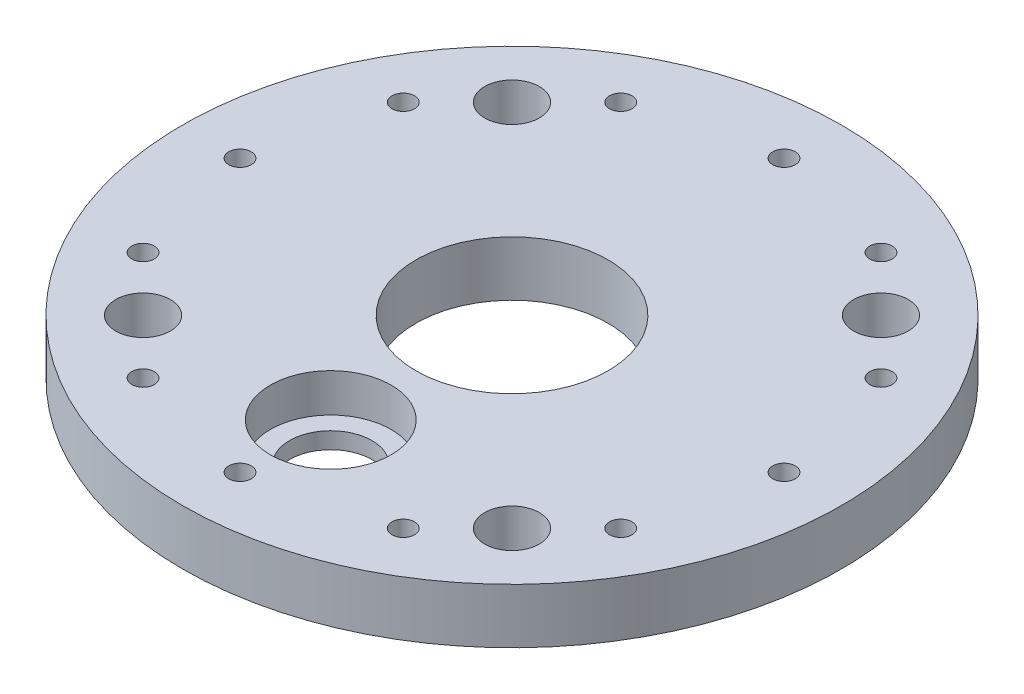
ISO-10303-21;
HEADER;
FILE_DESCRIPTION(('STEP AP214'),'2;1');
FILE_NAME('part.step','',(''),(''),'','','');
FILE_SCHEMA(('AUTOMOTIVE_DESIGN { 1 0 10303 214 1 1 1 1 }'));
ENDSEC;
DATA;
#1=APPLICATION_CONTEXT('core data for automotive mechanical design processes');
#2=APPLICATION_PROTOCOL_DEFINITION('international standard','automotive_design',2000,#1);
#3=PRODUCT_CONTEXT('',#1,'mechanical');
#4=PRODUCT('Part','Part','',(#3));
#5=PRODUCT_RELATED_PRODUCT_CATEGORY('part','',(#4));
#6=PRODUCT_DEFINITION_FORMATION('','',#4);
#7=PRODUCT_DEFINITION_CONTEXT('part definition',#1,'design');
#8=PRODUCT_DEFINITION('design','',#6,#7);
#9=PRODUCT_DEFINITION_SHAPE('','',#8);
#10=(LENGTH_UNIT() NAMED_UNIT(*) SI_UNIT(.MILLI.,.METRE.));
#11=(NAMED_UNIT(*) PLANE_ANGLE_UNIT() SI_UNIT($,.RADIAN.));
#12=(NAMED_UNIT(*) SI_UNIT($,.STERADIAN.) SOLID_ANGLE_UNIT());
#13=UNCERTAINTY_MEASURE_WITH_UNIT(LENGTH_MEASURE(1.E-05),#10,'distance_accuracy_value','');
#14=(GEOMETRIC_REPRESENTATION_CONTEXT(3) GLOBAL_UNCERTAINTY_ASSIGNED_CONTEXT((#13)) GLOBAL_UNIT_ASSIGNED_CONTEXT((#10,
#11,#12)) REPRESENTATION_CONTEXT('',''));
#15=CARTESIAN_POINT('',(0.,0.,0.));
#16=DIRECTION('',(0.,0.,1.));
#17=DIRECTION('',(1.,0.,0.));
#18=AXIS2_PLACEMENT_3D('',#15,#16,#17);
#19=CARTESIAN_POINT('',(0.,10.,0.));
#20=DIRECTION('',(0.,-1.,0.));
#21=DIRECTION('',(0.,0.,-1.));
#22=AXIS2_PLACEMENT_3D('',#19,#20,#21);
#23=CYLINDRICAL_SURFACE('',#22,60.);
#24=CARTESIAN_POINT('',(0.,10.,0.));
#25=DIRECTION('',(0.,1.,0.));
#26=DIRECTION('',(0.,0.,1.));
#27=AXIS2_PLACEMENT_3D('',#24,#25,#26);
#28=CIRCLE('',#27,60.);
#29=CARTESIAN_POINT('',(0.,10.,60.));
#30=VERTEX_POINT('',#29);
#31=EDGE_CURVE('E10',#30,#30,#28,.T.);
#32=ORIENTED_EDGE('',*,*,#31,.F.);
#33=EDGE_LOOP('',(#32));
#34=FACE_BOUND('',#33,.T.);
#35=CARTESIAN_POINT('',(0.,0.,0.));
#36=DIRECTION('',(0.,1.,0.));
#37=DIRECTION('',(0.,0.,1.));
#38=AXIS2_PLACEMENT_3D('',#35,#36,#37);
#39=CIRCLE('',#38,60.);
#40=CARTESIAN_POINT('',(0.,0.,60.));
#41=VERTEX_POINT('',#40);
#42=EDGE_CURVE('E41',#41,#41,#39,.T.);
#43=ORIENTED_EDGE('',*,*,#42,.T.);
#44=EDGE_LOOP('',(#43));
#45=FACE_BOUND('',#44,.T.);
#46=ADVANCED_FACE('F36',(#34,#45),#23,.T.);
#47=CARTESIAN_POINT('',(0.,10.,0.));
#48=DIRECTION('',(0.,1.,0.));
#49=DIRECTION('',(0.,0.,1.));
#50=AXIS2_PLACEMENT_3D('',#47,#48,#49);
#51=PLANE('',#50);
#52=CARTESIAN_POINT('',(0.,10.,0.));
#53=DIRECTION('',(0.,1.,0.));
#54=DIRECTION('',(0.,0.,1.));
#55=AXIS2_PLACEMENT_3D('',#52,#53,#54);
#56=CIRCLE('',#55,17.5);
#57=CARTESIAN_POINT('',(0.,10.,17.5));
#58=VERTEX_POINT('',#57);
#59=EDGE_CURVE('E158',#58,#58,#56,.T.);
#60=ORIENTED_EDGE('',*,*,#59,.F.);
#61=EDGE_LOOP('',(#60));
#62=FACE_BOUND('',#61,.T.);
#63=CARTESIAN_POINT('',(-49.52,10.,-1.72898155899512E-13));
#64=DIRECTION('',(0.,1.,0.));
#65=DIRECTION('',(-1.,0.,0.));
#66=AXIS2_PLACEMENT_3D('',#63,#64,#65);
#67=CIRCLE('',#66,2.05);
#68=CARTESIAN_POINT('',(-51.57,10.,-1.8005569264414E-13));
#69=VERTEX_POINT('',#68);
#70=EDGE_CURVE('E153',#69,#69,#67,.T.);
#71=ORIENTED_EDGE('',*,*,#70,.F.);
#72=EDGE_LOOP('',(#71));
#73=FACE_BOUND('',#72,.T.);
#74=CARTESIAN_POINT('',(0.,10.,-49.52));
#75=DIRECTION('',(0.,1.,0.));
#76=DIRECTION('',(0.,0.,-1.));
#77=AXIS2_PLACEMENT_3D('',#74,#75,#76);
#78=CIRCLE('',#77,2.05);
#79=CARTESIAN_POINT('',(0.,10.,-51.57));
#80=VERTEX_POINT('',#79);
#81=EDGE_CURVE('E150',#80,#80,#78,.T.);
#82=ORIENTED_EDGE('',*,*,#81,.F.);
#83=EDGE_LOOP('',(#82));
#84=FACE_BOUND('',#83,.T.);
#85=CARTESIAN_POINT('',(49.52,10.,5.18694467698536E-13));
#86=DIRECTION('',(0.,1.,0.));
#87=DIRECTION('',(1.,0.,0.));
#88=AXIS2_PLACEMENT_3D('',#85,#86,#87);
#89=CIRCLE('',#88,2.05);
#90=CARTESIAN_POINT('',(51.57,10.,5.40167077932421E-13));
#91=VERTEX_POINT('',#90);
#92=EDGE_CURVE('E140',#91,#91,#89,.T.);
#93=ORIENTED_EDGE('',*,*,#92,.F.);
#94=EDGE_LOOP('',(#93));
#95=FACE_BOUND('',#94,.T.);
#96=CARTESIAN_POINT('',(-23.6880771697492,10.,-43.4870670429728));
#97=DIRECTION('',(0.,1.,0.));
#98=DIRECTION('',(-1.,0.,0.));
#99=AXIS2_PLACEMENT_3D('',#96,#97,#98);
#100=CIRCLE('',#99,2.05);
#101=CARTESIAN_POINT('',(-25.7380771697492,10.,-43.4870670429728));
#102=VERTEX_POINT('',#101);
#103=EDGE_CURVE('E112',#102,#102,#100,.T.);
#104=ORIENTED_EDGE('',*,*,#103,.F.);
#105=EDGE_LOOP('',(#104));
#106=FACE_BOUND('',#105,.T.);
#107=CARTESIAN_POINT('',(-43.4870670429726,10.,-23.6880771697495));
#108=DIRECTION('',(0.,1.,0.));
#109=DIRECTION('',(-1.,0.,0.));
#110=AXIS2_PLACEMENT_3D('',#107,#108,#109);
#111=CIRCLE('',#110,2.05);
#112=CARTESIAN_POINT('',(-45.5370670429726,10.,-23.6880771697495));
#113=VERTEX_POINT('',#112);
#114=EDGE_CURVE('E104',#113,#113,#111,.T.);
#115=ORIENTED_EDGE('',*,*,#114,.F.);
#116=EDGE_LOOP('',(#115));
#117=FACE_BOUND('',#116,.T.);
#118=CARTESIAN_POINT('',(33.5875721063611,10.,-33.587572106361));
#119=DIRECTION('',(0.,1.,0.));
#120=DIRECTION('',(0.,0.,-1.));
#121=AXIS2_PLACEMENT_3D('',#118,#119,#120);
#122=CIRCLE('',#121,4.975);
#123=CARTESIAN_POINT('',(33.5875721063611,10.,-38.562572106361));
#124=VERTEX_POINT('',#123);
#125=EDGE_CURVE('E97',#124,#124,#122,.T.);
#126=ORIENTED_EDGE('',*,*,#125,.F.);
#127=EDGE_LOOP('',(#126));
#128=FACE_BOUND('',#127,.T.);
#129=CARTESIAN_POINT('',(43.4870670429727,10.,-23.6880771697493));
#130=DIRECTION('',(0.,1.,0.));
#131=DIRECTION('',(0.,0.,-1.));
#132=AXIS2_PLACEMENT_3D('',#129,#130,#131);
#133=CIRCLE('',#132,2.05);
#134=CARTESIAN_POINT('',(43.4870670429727,10.,-25.7380771697493));
#135=VERTEX_POINT('',#134);
#136=EDGE_CURVE('E95',#135,#135,#133,.T.);
#137=ORIENTED_EDGE('',*,*,#136,.F.);
#138=EDGE_LOOP('',(#137));
#139=FACE_BOUND('',#138,.T.);
#140=CARTESIAN_POINT('',(43.4870670429724,10.,23.6880771697498));
#141=DIRECTION('',(0.,1.,0.));
#142=DIRECTION('',(1.,0.,0.));
#143=AXIS2_PLACEMENT_3D('',#140,#141,#142);
#144=CIRCLE('',#143,2.05);
#145=CARTESIAN_POINT('',(45.5370670429724,10.,23.6880771697498));
#146=VERTEX_POINT('',#145);
#147=EDGE_CURVE('E126',#146,#146,#144,.T.);
#148=ORIENTED_EDGE('',*,*,#147,.F.);
#149=EDGE_LOOP('',(#148));
#150=FACE_BOUND('',#149,.T.);
#151=CARTESIAN_POINT('',(23.6880771697489,10.,43.4870670429729));
#152=DIRECTION('',(0.,1.,0.));
#153=DIRECTION('',(1.,0.,0.));
#154=AXIS2_PLACEMENT_3D('',#151,#152,#153);
#155=CIRCLE('',#154,2.05);
#156=CARTESIAN_POINT('',(25.7380771697489,10.,43.4870670429729));
#157=VERTEX_POINT('',#156);
#158=EDGE_CURVE('E134',#157,#157,#155,.T.);
#159=ORIENTED_EDGE('',*,*,#158,.F.);
#160=EDGE_LOOP('',(#159));
#161=FACE_BOUND('',#160,.T.);
#162=CARTESIAN_POINT('',(33.5875721063606,10.,33.5875721063614));
#163=DIRECTION('',(0.,1.,0.));
#164=DIRECTION('',(1.,0.,0.));
#165=AXIS2_PLACEMENT_3D('',#162,#163,#164);
#166=CIRCLE('',#165,4.975);
#167=CARTESIAN_POINT('',(38.5625721063606,10.,33.5875721063615));
#168=VERTEX_POINT('',#167);
#169=EDGE_CURVE('E116',#168,#168,#166,.T.);
#170=ORIENTED_EDGE('',*,*,#169,.F.);
#171=EDGE_LOOP('',(#170));
#172=FACE_BOUND('',#171,.T.);
#173=CARTESIAN_POINT('',(23.6880771697493,10.,-43.4870670429727));
#174=DIRECTION('',(0.,1.,0.));
#175=DIRECTION('',(0.,0.,-1.));
#176=AXIS2_PLACEMENT_3D('',#173,#174,#175);
#177=CIRCLE('',#176,2.05);
#178=CARTESIAN_POINT('',(23.6880771697493,10.,-45.5370670429727));
#179=VERTEX_POINT('',#178);
#180=EDGE_CURVE('E121',#179,#179,#177,.T.);
#181=ORIENTED_EDGE('',*,*,#180,.F.);
#182=EDGE_LOOP('',(#181));
#183=FACE_BOUND('',#182,.T.);
#184=CARTESIAN_POINT('',(-33.5875721063608,10.,-33.5875721063612));
#185=DIRECTION('',(0.,1.,0.));
#186=DIRECTION('',(-1.,0.,0.));
#187=AXIS2_PLACEMENT_3D('',#184,#185,#186);
#188=CIRCLE('',#187,4.975);
#189=CARTESIAN_POINT('',(-38.5625721063608,10.,-33.5875721063612));
#190=VERTEX_POINT('',#189);
#191=EDGE_CURVE('E88',#190,#190,#188,.T.);
#192=ORIENTED_EDGE('',*,*,#191,.F.);
#193=EDGE_LOOP('',(#192));
#194=FACE_BOUND('',#193,.T.);
#195=CARTESIAN_POINT('',(0.,10.,49.52));
#196=DIRECTION('',(0.,1.,0.));
#197=DIRECTION('',(0.,0.,1.));
#198=AXIS2_PLACEMENT_3D('',#195,#196,#197);
#199=CIRCLE('',#198,2.05);
#200=CARTESIAN_POINT('',(0.,10.,51.57));
#201=VERTEX_POINT('',#200);
#202=EDGE_CURVE('E79',#201,#201,#199,.T.);
#203=ORIENTED_EDGE('',*,*,#202,.F.);
#204=EDGE_LOOP('',(#203));
#205=FACE_BOUND('',#204,.T.);
#206=CARTESIAN_POINT('',(-23.6880771697493,10.,43.4870670429727));
#207=DIRECTION('',(0.,1.,0.));
#208=DIRECTION('',(0.,0.,1.));
#209=AXIS2_PLACEMENT_3D('',#206,#207,#208);
#210=CIRCLE('',#209,2.05);
#211=CARTESIAN_POINT('',(-23.6880771697493,10.,45.5370670429727));
#212=VERTEX_POINT('',#211);
#213=EDGE_CURVE('E66',#212,#212,#210,.T.);
#214=ORIENTED_EDGE('',*,*,#213,.F.);
#215=EDGE_LOOP('',(#214));
#216=FACE_BOUND('',#215,.T.);
#217=CARTESIAN_POINT('',(-43.4870670429727,10.,23.6880771697493));
#218=DIRECTION('',(0.,1.,0.));
#219=DIRECTION('',(0.,0.,1.));
#220=AXIS2_PLACEMENT_3D('',#217,#218,#219);
#221=CIRCLE('',#220,2.05);
#222=CARTESIAN_POINT('',(-43.4870670429727,10.,25.7380771697493));
#223=VERTEX_POINT('',#222);
#224=EDGE_CURVE('E73',#223,#223,#221,.T.);
#225=ORIENTED_EDGE('',*,*,#224,.F.);
#226=EDGE_LOOP('',(#225));
#227=FACE_BOUND('',#226,.T.);
#228=CARTESIAN_POINT('',(-33.5875721063611,10.,33.587572106361));
#229=DIRECTION('',(0.,1.,0.));
#230=DIRECTION('',(0.,0.,1.));
#231=AXIS2_PLACEMENT_3D('',#228,#229,#230);
#232=CIRCLE('',#231,4.975);
#233=CARTESIAN_POINT('',(-33.5875721063611,10.,38.562572106361));
#234=VERTEX_POINT('',#233);
#235=EDGE_CURVE('E65',#234,#234,#232,.T.);
#236=ORIENTED_EDGE('',*,*,#235,.F.);
#237=EDGE_LOOP('',(#236));
#238=FACE_BOUND('',#237,.T.);
#239=CARTESIAN_POINT('',(0.,10.,33.));
#240=DIRECTION('',(0.,1.,0.));
#241=DIRECTION('',(0.,0.,1.));
#242=AXIS2_PLACEMENT_3D('',#239,#240,#241);
#243=CIRCLE('',#242,11.);
#244=CARTESIAN_POINT('',(0.,10.,44.));
#245=VERTEX_POINT('',#244);
#246=EDGE_CURVE('E49',#245,#245,#243,.T.);
#247=ORIENTED_EDGE('',*,*,#246,.F.);
#248=EDGE_LOOP('',(#247));
#249=FACE_BOUND('',#248,.T.);
#250=ORIENTED_EDGE('',*,*,#31,.T.);
#251=EDGE_LOOP('',(#250));
#252=FACE_BOUND('',#251,.T.);
#253=ADVANCED_FACE('F173',(#62,#73,#84,#95,#106,#117,#128,#139,#150,#161,#172,#183,#194,#205,
#216,#227,#238,#249,#252),#51,.T.);
#254=CARTESIAN_POINT('',(0.,0.,0.));
#255=DIRECTION('',(0.,1.,0.));
#256=DIRECTION('',(0.,0.,1.));
#257=AXIS2_PLACEMENT_3D('',#254,#255,#256);
#258=PLANE('',#257);
#259=CARTESIAN_POINT('',(0.,0.,0.));
#260=DIRECTION('',(0.,1.,0.));
#261=DIRECTION('',(0.,0.,1.));
#262=AXIS2_PLACEMENT_3D('',#259,#260,#261);
#263=CIRCLE('',#262,17.5);
#264=CARTESIAN_POINT('',(0.,0.,17.5));
#265=VERTEX_POINT('',#264);
#266=EDGE_CURVE('E145',#265,#265,#263,.T.);
#267=ORIENTED_EDGE('',*,*,#266,.T.);
#268=EDGE_LOOP('',(#267));
#269=FACE_BOUND('',#268,.T.);
#270=CARTESIAN_POINT('',(-49.52,0.,-1.72898155899512E-13));
#271=DIRECTION('',(0.,1.,0.));
#272=DIRECTION('',(-1.,0.,0.));
#273=AXIS2_PLACEMENT_3D('',#270,#271,#272);
#274=CIRCLE('',#273,2.05);
#275=CARTESIAN_POINT('',(-51.57,0.,-1.8005569264414E-13));
#276=VERTEX_POINT('',#275);
#277=EDGE_CURVE('E135',#276,#276,#274,.T.);
#278=ORIENTED_EDGE('',*,*,#277,.T.);
#279=EDGE_LOOP('',(#278));
#280=FACE_BOUND('',#279,.T.);
#281=CARTESIAN_POINT('',(0.,0.,-49.52));
#282=DIRECTION('',(0.,1.,0.));
#283=DIRECTION('',(0.,0.,-1.));
#284=AXIS2_PLACEMENT_3D('',#281,#282,#283);
#285=CIRCLE('',#284,2.05);
#286=CARTESIAN_POINT('',(0.,0.,-51.57));
#287=VERTEX_POINT('',#286);
#288=EDGE_CURVE('E147',#287,#287,#285,.T.);
#289=ORIENTED_EDGE('',*,*,#288,.T.);
#290=EDGE_LOOP('',(#289));
#291=FACE_BOUND('',#290,.T.);
#292=CARTESIAN_POINT('',(49.52,0.,5.18694467698536E-13));
#293=DIRECTION('',(0.,1.,0.));
#294=DIRECTION('',(1.,0.,0.));
#295=AXIS2_PLACEMENT_3D('',#292,#293,#294);
#296=CIRCLE('',#295,2.05);
#297=CARTESIAN_POINT('',(51.57,0.,5.40167077932421E-13));
#298=VERTEX_POINT('',#297);
#299=EDGE_CURVE('E141',#298,#298,#296,.T.);
#300=ORIENTED_EDGE('',*,*,#299,.T.);
#301=EDGE_LOOP('',(#300));
#302=FACE_BOUND('',#301,.T.);
#303=CARTESIAN_POINT('',(-23.6880771697492,0.,-43.4870670429728));
#304=DIRECTION('',(0.,1.,0.));
#305=DIRECTION('',(-1.,0.,0.));
#306=AXIS2_PLACEMENT_3D('',#303,#304,#305);
#307=CIRCLE('',#306,2.05);
#308=CARTESIAN_POINT('',(-25.7380771697492,0.,-43.4870670429728));
#309=VERTEX_POINT('',#308);
#310=EDGE_CURVE('E90',#309,#309,#307,.T.);
#311=ORIENTED_EDGE('',*,*,#310,.T.);
#312=EDGE_LOOP('',(#311));
#313=FACE_BOUND('',#312,.T.);
#314=CARTESIAN_POINT('',(-43.4870670429726,0.,-23.6880771697495));
#315=DIRECTION('',(0.,1.,0.));
#316=DIRECTION('',(-1.,0.,0.));
#317=AXIS2_PLACEMENT_3D('',#314,#315,#316);
#318=CIRCLE('',#317,2.05);
#319=CARTESIAN_POINT('',(-45.5370670429726,0.,-23.6880771697495));
#320=VERTEX_POINT('',#319);
#321=EDGE_CURVE('E107',#320,#320,#318,.T.);
#322=ORIENTED_EDGE('',*,*,#321,.T.);
#323=EDGE_LOOP('',(#322));
#324=FACE_BOUND('',#323,.T.);
#325=CARTESIAN_POINT('',(33.5875721063611,0.,-33.587572106361));
#326=DIRECTION('',(0.,1.,0.));
#327=DIRECTION('',(0.,0.,-1.));
#328=AXIS2_PLACEMENT_3D('',#325,#326,#327);
#329=CIRCLE('',#328,4.975);
#330=CARTESIAN_POINT('',(33.5875721063611,0.,-38.562572106361));
#331=VERTEX_POINT('',#330);
#332=EDGE_CURVE('E105',#331,#331,#329,.T.);
#333=ORIENTED_EDGE('',*,*,#332,.T.);
#334=EDGE_LOOP('',(#333));
#335=FACE_BOUND('',#334,.T.);
#336=CARTESIAN_POINT('',(43.4870670429727,0.,-23.6880771697493));
#337=DIRECTION('',(0.,1.,0.));
#338=DIRECTION('',(0.,0.,-1.));
#339=AXIS2_PLACEMENT_3D('',#336,#337,#338);
#340=CIRCLE('',#339,2.05);
#341=CARTESIAN_POINT('',(43.4870670429727,0.,-25.7380771697493));
#342=VERTEX_POINT('',#341);
#343=EDGE_CURVE('E92',#342,#342,#340,.T.);
#344=ORIENTED_EDGE('',*,*,#343,.T.);
#345=EDGE_LOOP('',(#344));
#346=FACE_BOUND('',#345,.T.);
#347=CARTESIAN_POINT('',(43.4870670429724,0.,23.6880771697498));
#348=DIRECTION('',(0.,1.,0.));
#349=DIRECTION('',(1.,0.,0.));
#350=AXIS2_PLACEMENT_3D('',#347,#348,#349);
#351=CIRCLE('',#350,2.05);
#352=CARTESIAN_POINT('',(45.5370670429724,0.,23.6880771697498));
#353=VERTEX_POINT('',#352);
#354=EDGE_CURVE('E131',#353,#353,#351,.T.);
#355=ORIENTED_EDGE('',*,*,#354,.T.);
#356=EDGE_LOOP('',(#355));
#357=FACE_BOUND('',#356,.T.);
#358=CARTESIAN_POINT('',(23.6880771697489,0.,43.4870670429729));
#359=DIRECTION('',(0.,1.,0.));
#360=DIRECTION('',(1.,0.,0.));
#361=AXIS2_PLACEMENT_3D('',#358,#359,#360);
#362=CIRCLE('',#361,2.05);
#363=CARTESIAN_POINT('',(25.7380771697489,0.,43.4870670429729));
#364=VERTEX_POINT('',#363);
#365=EDGE_CURVE('E119',#364,#364,#362,.T.);
#366=ORIENTED_EDGE('',*,*,#365,.T.);
#367=EDGE_LOOP('',(#366));
#368=FACE_BOUND('',#367,.T.);
#369=CARTESIAN_POINT('',(33.5875721063606,0.,33.5875721063614));
#370=DIRECTION('',(0.,1.,0.));
#371=DIRECTION('',(1.,0.,0.));
#372=AXIS2_PLACEMENT_3D('',#369,#370,#371);
#373=CIRCLE('',#372,4.975);
#374=CARTESIAN_POINT('',(38.5625721063606,0.,33.5875721063615));
#375=VERTEX_POINT('',#374);
#376=EDGE_CURVE('E118',#375,#375,#373,.T.);
#377=ORIENTED_EDGE('',*,*,#376,.T.);
#378=EDGE_LOOP('',(#377));
#379=FACE_BOUND('',#378,.T.);
#380=CARTESIAN_POINT('',(23.6880771697493,0.,-43.4870670429727));
#381=DIRECTION('',(0.,1.,0.));
#382=DIRECTION('',(0.,0.,-1.));
#383=AXIS2_PLACEMENT_3D('',#380,#381,#382);
#384=CIRCLE('',#383,2.05);
#385=CARTESIAN_POINT('',(23.6880771697493,0.,-45.5370670429727));
#386=VERTEX_POINT('',#385);
#387=EDGE_CURVE('E96',#386,#386,#384,.T.);
#388=ORIENTED_EDGE('',*,*,#387,.T.);
#389=EDGE_LOOP('',(#388));
#390=FACE_BOUND('',#389,.T.);
#391=CARTESIAN_POINT('',(-33.5875721063608,0.,-33.5875721063612));
#392=DIRECTION('',(0.,1.,0.));
#393=DIRECTION('',(-1.,0.,0.));
#394=AXIS2_PLACEMENT_3D('',#391,#392,#393);
#395=CIRCLE('',#394,4.975);
#396=CARTESIAN_POINT('',(-38.5625721063608,0.,-33.5875721063612));
#397=VERTEX_POINT('',#396);
#398=EDGE_CURVE('E84',#397,#397,#395,.T.);
#399=ORIENTED_EDGE('',*,*,#398,.T.);
#400=EDGE_LOOP('',(#399));
#401=FACE_BOUND('',#400,.T.);
#402=CARTESIAN_POINT('',(0.,0.,49.52));
#403=DIRECTION('',(0.,1.,0.));
#404=DIRECTION('',(0.,0.,1.));
#405=AXIS2_PLACEMENT_3D('',#402,#403,#404);
#406=CIRCLE('',#405,2.05);
#407=CARTESIAN_POINT('',(0.,0.,51.57));
#408=VERTEX_POINT('',#407);
#409=EDGE_CURVE('E75',#408,#408,#406,.T.);
#410=ORIENTED_EDGE('',*,*,#409,.T.);
#411=EDGE_LOOP('',(#410));
#412=FACE_BOUND('',#411,.T.);
#413=CARTESIAN_POINT('',(-23.6880771697493,0.,43.4870670429727));
#414=DIRECTION('',(0.,1.,0.));
#415=DIRECTION('',(0.,0.,1.));
#416=AXIS2_PLACEMENT_3D('',#413,#414,#415);
#417=CIRCLE('',#416,2.05);
#418=CARTESIAN_POINT('',(-23.6880771697493,0.,45.5370670429727));
#419=VERTEX_POINT('',#418);
#420=EDGE_CURVE('E72',#419,#419,#417,.T.);
#421=ORIENTED_EDGE('',*,*,#420,.T.);
#422=EDGE_LOOP('',(#421));
#423=FACE_BOUND('',#422,.T.);
#424=CARTESIAN_POINT('',(-43.4870670429727,0.,23.6880771697493));
#425=DIRECTION('',(0.,1.,0.));
#426=DIRECTION('',(0.,0.,1.));
#427=AXIS2_PLACEMENT_3D('',#424,#425,#426);
#428=CIRCLE('',#427,2.05);
#429=CARTESIAN_POINT('',(-43.4870670429727,0.,25.7380771697493));
#430=VERTEX_POINT('',#429);
#431=EDGE_CURVE('E64',#430,#430,#428,.T.);
#432=ORIENTED_EDGE('',*,*,#431,.T.);
#433=EDGE_LOOP('',(#432));
#434=FACE_BOUND('',#433,.T.);
#435=CARTESIAN_POINT('',(-33.5875721063611,0.,33.587572106361));
#436=DIRECTION('',(0.,1.,0.));
#437=DIRECTION('',(0.,0.,1.));
#438=AXIS2_PLACEMENT_3D('',#435,#436,#437);
#439=CIRCLE('',#438,4.975);
#440=CARTESIAN_POINT('',(-33.5875721063611,0.,38.562572106361));
#441=VERTEX_POINT('',#440);
#442=EDGE_CURVE('E56',#441,#441,#439,.T.);
#443=ORIENTED_EDGE('',*,*,#442,.T.);
#444=EDGE_LOOP('',(#443));
#445=FACE_BOUND('',#444,.T.);
#446=CARTESIAN_POINT('',(0.,0.,33.));
#447=DIRECTION('',(0.,1.,0.));
#448=DIRECTION('',(0.,0.,1.));
#449=AXIS2_PLACEMENT_3D('',#446,#447,#448);
#450=CIRCLE('',#449,7.5);
#451=CARTESIAN_POINT('',(0.,0.,40.5));
#452=VERTEX_POINT('',#451);
#453=EDGE_CURVE('E52',#452,#452,#450,.T.);
#454=ORIENTED_EDGE('',*,*,#453,.T.);
#455=EDGE_LOOP('',(#454));
#456=FACE_BOUND('',#455,.T.);
#457=ORIENTED_EDGE('',*,*,#42,.F.);
#458=EDGE_LOOP('',(#457));
#459=FACE_BOUND('',#458,.T.);
#460=ADVANCED_FACE('F163',(#269,#280,#291,#302,#313,#324,#335,#346,#357,#368,#379,#390,#401,
#412,#423,#434,#445,#456,#459),#258,.F.);
#461=CARTESIAN_POINT('',(0.,3.,33.));
#462=DIRECTION('',(0.,1.,0.));
#463=DIRECTION('',(0.,0.,1.));
#464=AXIS2_PLACEMENT_3D('',#461,#462,#463);
#465=CYLINDRICAL_SURFACE('',#464,11.);
#466=CARTESIAN_POINT('',(0.,3.,33.));
#467=DIRECTION('',(0.,1.,0.));
#468=DIRECTION('',(0.,0.,1.));
#469=AXIS2_PLACEMENT_3D('',#466,#467,#468);
#470=CIRCLE('',#469,11.);
#471=CARTESIAN_POINT('',(0.,3.,44.));
#472=VERTEX_POINT('',#471);
#473=EDGE_CURVE('E48',#472,#472,#470,.T.);
#474=ORIENTED_EDGE('',*,*,#473,.F.);
#475=EDGE_LOOP('',(#474));
#476=FACE_BOUND('',#475,.T.);
#477=ORIENTED_EDGE('',*,*,#246,.T.);
#478=EDGE_LOOP('',(#477));
#479=FACE_BOUND('',#478,.T.);
#480=ADVANCED_FACE('F215',(#476,#479),#465,.F.);
#481=CARTESIAN_POINT('',(0.,3.,33.));
#482=DIRECTION('',(0.,1.,0.));
#483=DIRECTION('',(0.,0.,1.));
#484=AXIS2_PLACEMENT_3D('',#481,#482,#483);
#485=PLANE('',#484);
#486=CARTESIAN_POINT('',(0.,3.,33.));
#487=DIRECTION('',(0.,1.,0.));
#488=DIRECTION('',(0.,0.,1.));
#489=AXIS2_PLACEMENT_3D('',#486,#487,#488);
#490=CIRCLE('',#489,7.5);
#491=CARTESIAN_POINT('',(0.,3.,40.5));
#492=VERTEX_POINT('',#491);
#493=EDGE_CURVE('E57',#492,#492,#490,.T.);
#494=ORIENTED_EDGE('',*,*,#493,.F.);
#495=EDGE_LOOP('',(#494));
#496=FACE_BOUND('',#495,.T.);
#497=ORIENTED_EDGE('',*,*,#473,.T.);
#498=EDGE_LOOP('',(#497));
#499=FACE_BOUND('',#498,.T.);
#500=ADVANCED_FACE('F212',(#496,#499),#485,.T.);
#501=CARTESIAN_POINT('',(0.,0.,33.));
#502=DIRECTION('',(0.,1.,0.));
#503=DIRECTION('',(0.,0.,1.));
#504=AXIS2_PLACEMENT_3D('',#501,#502,#503);
#505=CYLINDRICAL_SURFACE('',#504,7.5);
#506=ORIENTED_EDGE('',*,*,#453,.F.);
#507=EDGE_LOOP('',(#506));
#508=FACE_BOUND('',#507,.T.);
#509=ORIENTED_EDGE('',*,*,#493,.T.);
#510=EDGE_LOOP('',(#509));
#511=FACE_BOUND('',#510,.T.);
#512=ADVANCED_FACE('F222',(#508,#511),#505,.F.);
#513=CARTESIAN_POINT('',(-33.5875721063611,0.,33.587572106361));
#514=DIRECTION('',(0.,1.,0.));
#515=DIRECTION('',(0.,0.,1.));
#516=AXIS2_PLACEMENT_3D('',#513,#514,#515);
#517=CYLINDRICAL_SURFACE('',#516,4.975);
#518=ORIENTED_EDGE('',*,*,#442,.F.);
#519=EDGE_LOOP('',(#518));
#520=FACE_BOUND('',#519,.T.);
#521=ORIENTED_EDGE('',*,*,#235,.T.);
#522=EDGE_LOOP('',(#521));
#523=FACE_BOUND('',#522,.T.);
#524=ADVANCED_FACE('F255',(#520,#523),#517,.F.);
#525=CARTESIAN_POINT('',(-43.4870670429727,0.,23.6880771697493));
#526=DIRECTION('',(0.,1.,0.));
#527=DIRECTION('',(0.,0.,1.));
#528=AXIS2_PLACEMENT_3D('',#525,#526,#527);
#529=CYLINDRICAL_SURFACE('',#528,2.05);
#530=ORIENTED_EDGE('',*,*,#431,.F.);
#531=EDGE_LOOP('',(#530));
#532=FACE_BOUND('',#531,.T.);
#533=ORIENTED_EDGE('',*,*,#224,.T.);
#534=EDGE_LOOP('',(#533));
#535=FACE_BOUND('',#534,.T.);
#536=ADVANCED_FACE('F265',(#532,#535),#529,.F.);
#537=CARTESIAN_POINT('',(-23.6880771697493,0.,43.4870670429727));
#538=DIRECTION('',(0.,1.,0.));
#539=DIRECTION('',(0.,0.,1.));
#540=AXIS2_PLACEMENT_3D('',#537,#538,#539);
#541=CYLINDRICAL_SURFACE('',#540,2.05);
#542=ORIENTED_EDGE('',*,*,#420,.F.);
#543=EDGE_LOOP('',(#542));
#544=FACE_BOUND('',#543,.T.);
#545=ORIENTED_EDGE('',*,*,#213,.T.);
#546=EDGE_LOOP('',(#545));
#547=FACE_BOUND('',#546,.T.);
#548=ADVANCED_FACE('F269',(#544,#547),#541,.F.);
#549=CARTESIAN_POINT('',(0.,0.,49.52));
#550=DIRECTION('',(0.,1.,0.));
#551=DIRECTION('',(0.,0.,1.));
#552=AXIS2_PLACEMENT_3D('',#549,#550,#551);
#553=CYLINDRICAL_SURFACE('',#552,2.05);
#554=ORIENTED_EDGE('',*,*,#409,.F.);
#555=EDGE_LOOP('',(#554));
#556=FACE_BOUND('',#555,.T.);
#557=ORIENTED_EDGE('',*,*,#202,.T.);
#558=EDGE_LOOP('',(#557));
#559=FACE_BOUND('',#558,.T.);
#560=ADVANCED_FACE('F279',(#556,#559),#553,.F.);
#561=CARTESIAN_POINT('',(-33.5875721063608,0.,-33.5875721063612));
#562=DIRECTION('',(0.,1.,0.));
#563=DIRECTION('',(0.,0.,1.));
#564=AXIS2_PLACEMENT_3D('',#561,#562,#563);
#565=CYLINDRICAL_SURFACE('',#564,4.975);
#566=ORIENTED_EDGE('',*,*,#398,.F.);
#567=EDGE_LOOP('',(#566));
#568=FACE_BOUND('',#567,.T.);
#569=ORIENTED_EDGE('',*,*,#191,.T.);
#570=EDGE_LOOP('',(#569));
#571=FACE_BOUND('',#570,.T.);
#572=ADVANCED_FACE('F288',(#568,#571),#565,.F.);
#573=CARTESIAN_POINT('',(23.6880771697493,0.,-43.4870670429727));
#574=DIRECTION('',(0.,1.,0.));
#575=DIRECTION('',(0.,0.,1.));
#576=AXIS2_PLACEMENT_3D('',#573,#574,#575);
#577=CYLINDRICAL_SURFACE('',#576,2.05);
#578=ORIENTED_EDGE('',*,*,#387,.F.);
#579=EDGE_LOOP('',(#578));
#580=FACE_BOUND('',#579,.T.);
#581=ORIENTED_EDGE('',*,*,#180,.T.);
#582=EDGE_LOOP('',(#581));
#583=FACE_BOUND('',#582,.T.);
#584=ADVANCED_FACE('F294',(#580,#583),#577,.F.);
#585=CARTESIAN_POINT('',(33.5875721063606,0.,33.5875721063614));
#586=DIRECTION('',(0.,1.,0.));
#587=DIRECTION('',(0.,0.,1.));
#588=AXIS2_PLACEMENT_3D('',#585,#586,#587);
#589=CYLINDRICAL_SURFACE('',#588,4.975);
#590=ORIENTED_EDGE('',*,*,#376,.F.);
#591=EDGE_LOOP('',(#590));
#592=FACE_BOUND('',#591,.T.);
#593=ORIENTED_EDGE('',*,*,#169,.T.);
#594=EDGE_LOOP('',(#593));
#595=FACE_BOUND('',#594,.T.);
#596=ADVANCED_FACE('F302',(#592,#595),#589,.F.);
#597=CARTESIAN_POINT('',(23.6880771697489,0.,43.4870670429729));
#598=DIRECTION('',(0.,1.,0.));
#599=DIRECTION('',(0.,0.,1.));
#600=AXIS2_PLACEMENT_3D('',#597,#598,#599);
#601=CYLINDRICAL_SURFACE('',#600,2.05);
#602=ORIENTED_EDGE('',*,*,#365,.F.);
#603=EDGE_LOOP('',(#602));
#604=FACE_BOUND('',#603,.T.);
#605=ORIENTED_EDGE('',*,*,#158,.T.);
#606=EDGE_LOOP('',(#605));
#607=FACE_BOUND('',#606,.T.);
#608=ADVANCED_FACE('F309',(#604,#607),#601,.F.);
#609=CARTESIAN_POINT('',(43.4870670429724,0.,23.6880771697498));
#610=DIRECTION('',(0.,1.,0.));
#611=DIRECTION('',(0.,0.,1.));
#612=AXIS2_PLACEMENT_3D('',#609,#610,#611);
#613=CYLINDRICAL_SURFACE('',#612,2.05);
#614=ORIENTED_EDGE('',*,*,#354,.F.);
#615=EDGE_LOOP('',(#614));
#616=FACE_BOUND('',#615,.T.);
#617=ORIENTED_EDGE('',*,*,#147,.T.);
#618=EDGE_LOOP('',(#617));
#619=FACE_BOUND('',#618,.T.);
#620=ADVANCED_FACE('F318',(#616,#619),#613,.F.);
#621=CARTESIAN_POINT('',(43.4870670429727,0.,-23.6880771697493));
#622=DIRECTION('',(0.,1.,0.));
#623=DIRECTION('',(0.,0.,1.));
#624=AXIS2_PLACEMENT_3D('',#621,#622,#623);
#625=CYLINDRICAL_SURFACE('',#624,2.05);
#626=ORIENTED_EDGE('',*,*,#343,.F.);
#627=EDGE_LOOP('',(#626));
#628=FACE_BOUND('',#627,.T.);
#629=ORIENTED_EDGE('',*,*,#136,.T.);
#630=EDGE_LOOP('',(#629));
#631=FACE_BOUND('',#630,.T.);
#632=ADVANCED_FACE('F326',(#628,#631),#625,.F.);
#633=CARTESIAN_POINT('',(33.5875721063611,0.,-33.587572106361));
#634=DIRECTION('',(0.,1.,0.));
#635=DIRECTION('',(0.,0.,1.));
#636=AXIS2_PLACEMENT_3D('',#633,#634,#635);
#637=CYLINDRICAL_SURFACE('',#636,4.975);
#638=ORIENTED_EDGE('',*,*,#332,.F.);
#639=EDGE_LOOP('',(#638));
#640=FACE_BOUND('',#639,.T.);
#641=ORIENTED_EDGE('',*,*,#125,.T.);
#642=EDGE_LOOP('',(#641));
#643=FACE_BOUND('',#642,.T.);
#644=ADVANCED_FACE('F331',(#640,#643),#637,.F.);
#645=CARTESIAN_POINT('',(-43.4870670429726,0.,-23.6880771697495));
#646=DIRECTION('',(0.,1.,0.));
#647=DIRECTION('',(0.,0.,1.));
#648=AXIS2_PLACEMENT_3D('',#645,#646,#647);
#649=CYLINDRICAL_SURFACE('',#648,2.05);
#650=ORIENTED_EDGE('',*,*,#321,.F.);
#651=EDGE_LOOP('',(#650));
#652=FACE_BOUND('',#651,.T.);
#653=ORIENTED_EDGE('',*,*,#114,.T.);
#654=EDGE_LOOP('',(#653));
#655=FACE_BOUND('',#654,.T.);
#656=ADVANCED_FACE('F345',(#652,#655),#649,.F.);
#657=CARTESIAN_POINT('',(-23.6880771697492,0.,-43.4870670429728));
#658=DIRECTION('',(0.,1.,0.));
#659=DIRECTION('',(0.,0.,1.));
#660=AXIS2_PLACEMENT_3D('',#657,#658,#659);
#661=CYLINDRICAL_SURFACE('',#660,2.05);
#662=ORIENTED_EDGE('',*,*,#310,.F.);
#663=EDGE_LOOP('',(#662));
#664=FACE_BOUND('',#663,.T.);
#665=ORIENTED_EDGE('',*,*,#103,.T.);
#666=EDGE_LOOP('',(#665));
#667=FACE_BOUND('',#666,.T.);
#668=ADVANCED_FACE('F348',(#664,#667),#661,.F.);
#669=CARTESIAN_POINT('',(49.52,0.,5.18694467698536E-13));
#670=DIRECTION('',(0.,1.,0.));
#671=DIRECTION('',(0.,0.,1.));
#672=AXIS2_PLACEMENT_3D('',#669,#670,#671);
#673=CYLINDRICAL_SURFACE('',#672,2.05);
#674=ORIENTED_EDGE('',*,*,#299,.F.);
#675=EDGE_LOOP('',(#674));
#676=FACE_BOUND('',#675,.T.);
#677=ORIENTED_EDGE('',*,*,#92,.T.);
#678=EDGE_LOOP('',(#677));
#679=FACE_BOUND('',#678,.T.);
#680=ADVANCED_FACE('F359',(#676,#679),#673,.F.);
#681=CARTESIAN_POINT('',(0.,0.,-49.52));
#682=DIRECTION('',(0.,1.,0.));
#683=DIRECTION('',(0.,0.,1.));
#684=AXIS2_PLACEMENT_3D('',#681,#682,#683);
#685=CYLINDRICAL_SURFACE('',#684,2.05);
#686=ORIENTED_EDGE('',*,*,#288,.F.);
#687=EDGE_LOOP('',(#686));
#688=FACE_BOUND('',#687,.T.);
#689=ORIENTED_EDGE('',*,*,#81,.T.);
#690=EDGE_LOOP('',(#689));
#691=FACE_BOUND('',#690,.T.);
#692=ADVANCED_FACE('F368',(#688,#691),#685,.F.);
#693=CARTESIAN_POINT('',(-49.52,0.,-1.72898155899512E-13));
#694=DIRECTION('',(0.,1.,0.));
#695=DIRECTION('',(0.,0.,1.));
#696=AXIS2_PLACEMENT_3D('',#693,#694,#695);
#697=CYLINDRICAL_SURFACE('',#696,2.05);
#698=ORIENTED_EDGE('',*,*,#277,.F.);
#699=EDGE_LOOP('',(#698));
#700=FACE_BOUND('',#699,.T.);
#701=ORIENTED_EDGE('',*,*,#70,.T.);
#702=EDGE_LOOP('',(#701));
#703=FACE_BOUND('',#702,.T.);
#704=ADVANCED_FACE('F168',(#700,#703),#697,.F.);
#705=CARTESIAN_POINT('',(0.,0.,0.));
#706=DIRECTION('',(0.,1.,0.));
#707=DIRECTION('',(0.,0.,1.));
#708=AXIS2_PLACEMENT_3D('',#705,#706,#707);
#709=CYLINDRICAL_SURFACE('',#708,17.5);
#710=ORIENTED_EDGE('',*,*,#266,.F.);
#711=EDGE_LOOP('',(#710));
#712=FACE_BOUND('',#711,.T.);
#713=ORIENTED_EDGE('',*,*,#59,.T.);
#714=EDGE_LOOP('',(#713));
#715=FACE_BOUND('',#714,.T.);
#716=ADVANCED_FACE('F170',(#712,#715),#709,.F.);
#717=CLOSED_SHELL('',(#46,#253,#460,#480,#500,#512,#524,#536,#548,#560,#572,#584,#596,#608,#620,
#632,#644,#656,#668,#680,#692,#704,#716));
#718=MANIFOLD_SOLID_BREP('B2',#717);
#719=ADVANCED_BREP_SHAPE_REPRESENTATION('',(#18,#718),#14);
#720=SHAPE_DEFINITION_REPRESENTATION(#9,#719);
ENDSEC;
END-ISO-10303-21;
